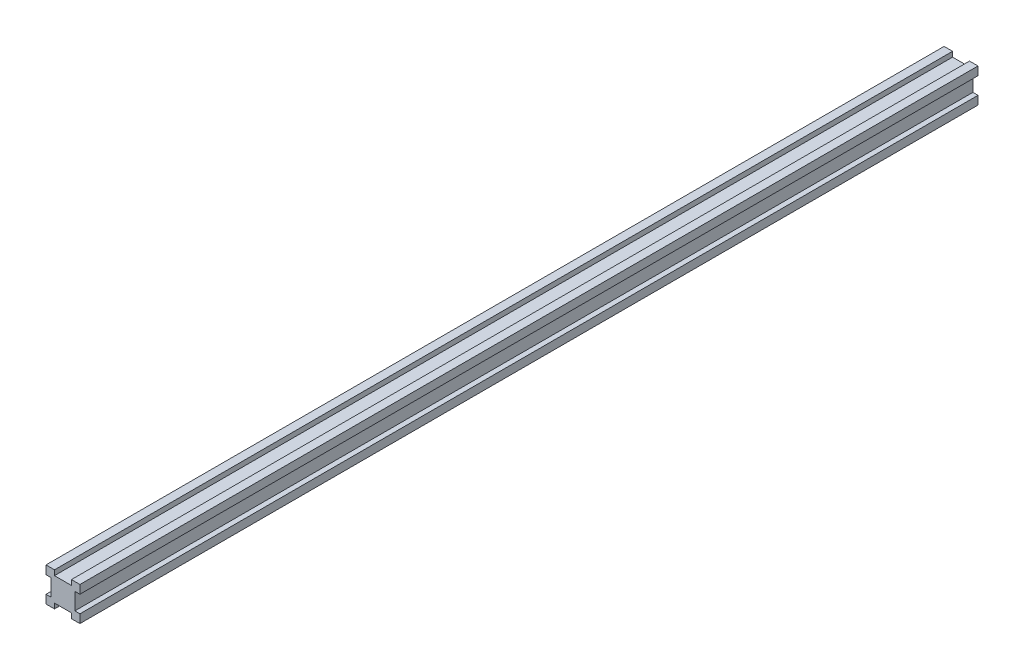
ISO-10303-21;
HEADER;
FILE_DESCRIPTION(('STEP AP214'),'2;1');
FILE_NAME('part.step','',(''),(''),'','','');
FILE_SCHEMA(('AUTOMOTIVE_DESIGN { 1 0 10303 214 1 1 1 1 }'));
ENDSEC;
DATA;
#1=APPLICATION_CONTEXT('core data for automotive mechanical design processes');
#2=APPLICATION_PROTOCOL_DEFINITION('international standard','automotive_design',2000,#1);
#3=PRODUCT_CONTEXT('',#1,'mechanical');
#4=PRODUCT('Part','Part','',(#3));
#5=PRODUCT_RELATED_PRODUCT_CATEGORY('part','',(#4));
#6=PRODUCT_DEFINITION_FORMATION('','',#4);
#7=PRODUCT_DEFINITION_CONTEXT('part definition',#1,'design');
#8=PRODUCT_DEFINITION('design','',#6,#7);
#9=PRODUCT_DEFINITION_SHAPE('','',#8);
#10=(LENGTH_UNIT() NAMED_UNIT(*) SI_UNIT(.MILLI.,.METRE.));
#11=(NAMED_UNIT(*) PLANE_ANGLE_UNIT() SI_UNIT($,.RADIAN.));
#12=(NAMED_UNIT(*) SI_UNIT($,.STERADIAN.) SOLID_ANGLE_UNIT());
#13=UNCERTAINTY_MEASURE_WITH_UNIT(LENGTH_MEASURE(1.E-05),#10,'distance_accuracy_value','');
#14=(GEOMETRIC_REPRESENTATION_CONTEXT(3) GLOBAL_UNCERTAINTY_ASSIGNED_CONTEXT((#13)) GLOBAL_UNIT_ASSIGNED_CONTEXT((#10,
#11,#12)) REPRESENTATION_CONTEXT('',''));
#15=CARTESIAN_POINT('',(0.,0.,0.));
#16=DIRECTION('',(0.,0.,1.));
#17=DIRECTION('',(1.,0.,0.));
#18=AXIS2_PLACEMENT_3D('',#15,#16,#17);
#19=CARTESIAN_POINT('',(-10.,0.,265.));
#20=DIRECTION('',(-1.,0.,0.));
#21=DIRECTION('',(0.,-1.,0.));
#22=AXIS2_PLACEMENT_3D('',#19,#20,#21);
#23=PLANE('',#22);
#24=DIRECTION('',(0.,1.,0.));
#25=VECTOR('',#24,1.);
#26=CARTESIAN_POINT('',(-10.,0.,-265.));
#27=LINE('',#26,#25);
#28=CARTESIAN_POINT('',(-10.,5.,-265.));
#29=VERTEX_POINT('',#28);
#30=CARTESIAN_POINT('',(-10.,10.,-265.));
#31=VERTEX_POINT('',#30);
#32=EDGE_CURVE('E204',#29,#31,#27,.T.);
#33=ORIENTED_EDGE('',*,*,#32,.F.);
#34=DIRECTION('',(0.,0.,-1.));
#35=VECTOR('',#34,1.);
#36=CARTESIAN_POINT('',(-10.,5.,265.));
#37=LINE('',#36,#35);
#38=CARTESIAN_POINT('',(-10.,5.,265.));
#39=VERTEX_POINT('',#38);
#40=EDGE_CURVE('E11',#39,#29,#37,.T.);
#41=ORIENTED_EDGE('',*,*,#40,.F.);
#42=DIRECTION('',(0.,1.,0.));
#43=VECTOR('',#42,1.);
#44=CARTESIAN_POINT('',(-10.,0.,265.));
#45=LINE('',#44,#43);
#46=CARTESIAN_POINT('',(-10.,10.,265.));
#47=VERTEX_POINT('',#46);
#48=EDGE_CURVE('E258',#39,#47,#45,.T.);
#49=ORIENTED_EDGE('',*,*,#48,.T.);
#50=DIRECTION('',(0.,0.,-1.));
#51=VECTOR('',#50,1.);
#52=CARTESIAN_POINT('',(-10.,10.,265.));
#53=LINE('',#52,#51);
#54=EDGE_CURVE('E55',#47,#31,#53,.T.);
#55=ORIENTED_EDGE('',*,*,#54,.T.);
#56=EDGE_LOOP('',(#33,#41,#49,#55));
#57=FACE_BOUND('',#56,.T.);
#58=ADVANCED_FACE('F39',(#57),#23,.T.);
#59=CARTESIAN_POINT('',(0.,5.,265.));
#60=DIRECTION('',(0.,-1.,0.));
#61=DIRECTION('',(1.,0.,0.));
#62=AXIS2_PLACEMENT_3D('',#59,#60,#61);
#63=PLANE('',#62);
#64=DIRECTION('',(-1.,0.,0.));
#65=VECTOR('',#64,1.);
#66=CARTESIAN_POINT('',(0.,5.,-265.));
#67=LINE('',#66,#65);
#68=CARTESIAN_POINT('',(-7.,5.,-265.));
#69=VERTEX_POINT('',#68);
#70=EDGE_CURVE('E206',#69,#29,#67,.T.);
#71=ORIENTED_EDGE('',*,*,#70,.F.);
#72=DIRECTION('',(0.,0.,-1.));
#73=VECTOR('',#72,1.);
#74=CARTESIAN_POINT('',(-7.,5.,265.));
#75=LINE('',#74,#73);
#76=CARTESIAN_POINT('',(-7.,5.,265.));
#77=VERTEX_POINT('',#76);
#78=EDGE_CURVE('E47',#77,#69,#75,.T.);
#79=ORIENTED_EDGE('',*,*,#78,.F.);
#80=DIRECTION('',(-1.,0.,0.));
#81=VECTOR('',#80,1.);
#82=CARTESIAN_POINT('',(0.,5.,265.));
#83=LINE('',#82,#81);
#84=EDGE_CURVE('E313',#77,#39,#83,.T.);
#85=ORIENTED_EDGE('',*,*,#84,.T.);
#86=ORIENTED_EDGE('',*,*,#40,.T.);
#87=EDGE_LOOP('',(#71,#79,#85,#86));
#88=FACE_BOUND('',#87,.T.);
#89=ADVANCED_FACE('F300',(#88),#63,.T.);
#90=CARTESIAN_POINT('',(-7.,0.,265.));
#91=DIRECTION('',(-1.,0.,0.));
#92=DIRECTION('',(0.,-1.,0.));
#93=AXIS2_PLACEMENT_3D('',#90,#91,#92);
#94=PLANE('',#93);
#95=DIRECTION('',(0.,1.,0.));
#96=VECTOR('',#95,1.);
#97=CARTESIAN_POINT('',(-7.,0.,-265.));
#98=LINE('',#97,#96);
#99=CARTESIAN_POINT('',(-7.,-5.,-265.));
#100=VERTEX_POINT('',#99);
#101=EDGE_CURVE('E209',#100,#69,#98,.T.);
#102=ORIENTED_EDGE('',*,*,#101,.F.);
#103=DIRECTION('',(0.,0.,-1.));
#104=VECTOR('',#103,1.);
#105=CARTESIAN_POINT('',(-7.,-5.,265.));
#106=LINE('',#105,#104);
#107=CARTESIAN_POINT('',(-7.,-5.,265.));
#108=VERTEX_POINT('',#107);
#109=EDGE_CURVE('E289',#108,#100,#106,.T.);
#110=ORIENTED_EDGE('',*,*,#109,.F.);
#111=DIRECTION('',(0.,1.,0.));
#112=VECTOR('',#111,1.);
#113=CARTESIAN_POINT('',(-7.,0.,265.));
#114=LINE('',#113,#112);
#115=EDGE_CURVE('E296',#108,#77,#114,.T.);
#116=ORIENTED_EDGE('',*,*,#115,.T.);
#117=ORIENTED_EDGE('',*,*,#78,.T.);
#118=EDGE_LOOP('',(#102,#110,#116,#117));
#119=FACE_BOUND('',#118,.T.);
#120=ADVANCED_FACE('F294',(#119),#94,.T.);
#121=CARTESIAN_POINT('',(0.,-5.,265.));
#122=DIRECTION('',(0.,1.,0.));
#123=DIRECTION('',(-1.,0.,0.));
#124=AXIS2_PLACEMENT_3D('',#121,#122,#123);
#125=PLANE('',#124);
#126=DIRECTION('',(1.,0.,0.));
#127=VECTOR('',#126,1.);
#128=CARTESIAN_POINT('',(0.,-5.,-265.));
#129=LINE('',#128,#127);
#130=CARTESIAN_POINT('',(-10.,-5.,-265.));
#131=VERTEX_POINT('',#130);
#132=EDGE_CURVE('E212',#131,#100,#129,.T.);
#133=ORIENTED_EDGE('',*,*,#132,.F.);
#134=DIRECTION('',(0.,0.,-1.));
#135=VECTOR('',#134,1.);
#136=CARTESIAN_POINT('',(-10.,-5.,265.));
#137=LINE('',#136,#135);
#138=CARTESIAN_POINT('',(-10.,-5.,265.));
#139=VERTEX_POINT('',#138);
#140=EDGE_CURVE('E287',#139,#131,#137,.T.);
#141=ORIENTED_EDGE('',*,*,#140,.F.);
#142=DIRECTION('',(1.,0.,0.));
#143=VECTOR('',#142,1.);
#144=CARTESIAN_POINT('',(0.,-5.,265.));
#145=LINE('',#144,#143);
#146=EDGE_CURVE('E310',#139,#108,#145,.T.);
#147=ORIENTED_EDGE('',*,*,#146,.T.);
#148=ORIENTED_EDGE('',*,*,#109,.T.);
#149=EDGE_LOOP('',(#133,#141,#147,#148));
#150=FACE_BOUND('',#149,.T.);
#151=ADVANCED_FACE('F307',(#150),#125,.T.);
#152=CARTESIAN_POINT('',(-9.99999999999999,0.,265.));
#153=DIRECTION('',(-1.,0.,0.));
#154=DIRECTION('',(0.,-1.,0.));
#155=AXIS2_PLACEMENT_3D('',#152,#153,#154);
#156=PLANE('',#155);
#157=DIRECTION('',(0.,1.,0.));
#158=VECTOR('',#157,1.);
#159=CARTESIAN_POINT('',(-9.99999999999999,0.,-265.));
#160=LINE('',#159,#158);
#161=CARTESIAN_POINT('',(-10.,-10.,-265.));
#162=VERTEX_POINT('',#161);
#163=EDGE_CURVE('E215',#162,#131,#160,.T.);
#164=ORIENTED_EDGE('',*,*,#163,.F.);
#165=DIRECTION('',(0.,0.,-1.));
#166=VECTOR('',#165,1.);
#167=CARTESIAN_POINT('',(-10.,-10.,265.));
#168=LINE('',#167,#166);
#169=CARTESIAN_POINT('',(-10.,-10.,265.));
#170=VERTEX_POINT('',#169);
#171=EDGE_CURVE('E285',#170,#162,#168,.T.);
#172=ORIENTED_EDGE('',*,*,#171,.F.);
#173=DIRECTION('',(0.,1.,0.));
#174=VECTOR('',#173,1.);
#175=CARTESIAN_POINT('',(-9.99999999999999,0.,265.));
#176=LINE('',#175,#174);
#177=EDGE_CURVE('E315',#170,#139,#176,.T.);
#178=ORIENTED_EDGE('',*,*,#177,.T.);
#179=ORIENTED_EDGE('',*,*,#140,.T.);
#180=EDGE_LOOP('',(#164,#172,#178,#179));
#181=FACE_BOUND('',#180,.T.);
#182=ADVANCED_FACE('F373',(#181),#156,.T.);
#183=CARTESIAN_POINT('',(0.,-10.,265.));
#184=DIRECTION('',(0.,1.,0.));
#185=DIRECTION('',(0.,0.,1.));
#186=AXIS2_PLACEMENT_3D('',#183,#184,#185);
#187=PLANE('',#186);
#188=DIRECTION('',(1.,0.,0.));
#189=VECTOR('',#188,1.);
#190=CARTESIAN_POINT('',(0.,-10.,-265.));
#191=LINE('',#190,#189);
#192=CARTESIAN_POINT('',(-5.,-10.,-265.));
#193=VERTEX_POINT('',#192);
#194=EDGE_CURVE('E218',#162,#193,#191,.T.);
#195=ORIENTED_EDGE('',*,*,#194,.T.);
#196=DIRECTION('',(0.,0.,-1.));
#197=VECTOR('',#196,1.);
#198=CARTESIAN_POINT('',(-5.,-10.,265.));
#199=LINE('',#198,#197);
#200=CARTESIAN_POINT('',(-5.,-10.,265.));
#201=VERTEX_POINT('',#200);
#202=EDGE_CURVE('E283',#201,#193,#199,.T.);
#203=ORIENTED_EDGE('',*,*,#202,.F.);
#204=DIRECTION('',(1.,0.,0.));
#205=VECTOR('',#204,1.);
#206=CARTESIAN_POINT('',(0.,-10.,265.));
#207=LINE('',#206,#205);
#208=EDGE_CURVE('E321',#170,#201,#207,.T.);
#209=ORIENTED_EDGE('',*,*,#208,.F.);
#210=ORIENTED_EDGE('',*,*,#171,.T.);
#211=EDGE_LOOP('',(#195,#203,#209,#210));
#212=FACE_BOUND('',#211,.T.);
#213=ADVANCED_FACE('F376',(#212),#187,.F.);
#214=CARTESIAN_POINT('',(-5.,0.,265.));
#215=DIRECTION('',(1.,0.,0.));
#216=DIRECTION('',(0.,0.,-1.));
#217=AXIS2_PLACEMENT_3D('',#214,#215,#216);
#218=PLANE('',#217);
#219=DIRECTION('',(0.,-1.,0.));
#220=VECTOR('',#219,1.);
#221=CARTESIAN_POINT('',(-5.,0.,-265.));
#222=LINE('',#221,#220);
#223=CARTESIAN_POINT('',(-5.,-7.,-265.));
#224=VERTEX_POINT('',#223);
#225=EDGE_CURVE('E221',#224,#193,#222,.T.);
#226=ORIENTED_EDGE('',*,*,#225,.F.);
#227=DIRECTION('',(0.,0.,-1.));
#228=VECTOR('',#227,1.);
#229=CARTESIAN_POINT('',(-5.,-7.,265.));
#230=LINE('',#229,#228);
#231=CARTESIAN_POINT('',(-5.,-7.,265.));
#232=VERTEX_POINT('',#231);
#233=EDGE_CURVE('E281',#232,#224,#230,.T.);
#234=ORIENTED_EDGE('',*,*,#233,.F.);
#235=DIRECTION('',(0.,-1.,0.));
#236=VECTOR('',#235,1.);
#237=CARTESIAN_POINT('',(-5.,0.,265.));
#238=LINE('',#237,#236);
#239=EDGE_CURVE('E323',#232,#201,#238,.T.);
#240=ORIENTED_EDGE('',*,*,#239,.T.);
#241=ORIENTED_EDGE('',*,*,#202,.T.);
#242=EDGE_LOOP('',(#226,#234,#240,#241));
#243=FACE_BOUND('',#242,.T.);
#244=ADVANCED_FACE('F378',(#243),#218,.T.);
#245=CARTESIAN_POINT('',(0.,-7.,265.));
#246=DIRECTION('',(0.,-1.,0.));
#247=DIRECTION('',(1.,0.,0.));
#248=AXIS2_PLACEMENT_3D('',#245,#246,#247);
#249=PLANE('',#248);
#250=DIRECTION('',(-1.,0.,0.));
#251=VECTOR('',#250,1.);
#252=CARTESIAN_POINT('',(0.,-7.,-265.));
#253=LINE('',#252,#251);
#254=CARTESIAN_POINT('',(5.,-7.,-265.));
#255=VERTEX_POINT('',#254);
#256=EDGE_CURVE('E225',#255,#224,#253,.T.);
#257=ORIENTED_EDGE('',*,*,#256,.F.);
#258=DIRECTION('',(0.,0.,-1.));
#259=VECTOR('',#258,1.);
#260=CARTESIAN_POINT('',(5.,-7.,265.));
#261=LINE('',#260,#259);
#262=CARTESIAN_POINT('',(5.,-7.,265.));
#263=VERTEX_POINT('',#262);
#264=EDGE_CURVE('E279',#263,#255,#261,.T.);
#265=ORIENTED_EDGE('',*,*,#264,.F.);
#266=DIRECTION('',(-1.,0.,0.));
#267=VECTOR('',#266,1.);
#268=CARTESIAN_POINT('',(0.,-7.,265.));
#269=LINE('',#268,#267);
#270=EDGE_CURVE('E327',#263,#232,#269,.T.);
#271=ORIENTED_EDGE('',*,*,#270,.T.);
#272=ORIENTED_EDGE('',*,*,#233,.T.);
#273=EDGE_LOOP('',(#257,#265,#271,#272));
#274=FACE_BOUND('',#273,.T.);
#275=ADVANCED_FACE('F381',(#274),#249,.T.);
#276=CARTESIAN_POINT('',(5.,0.,265.));
#277=DIRECTION('',(-1.,0.,0.));
#278=DIRECTION('',(0.,0.,1.));
#279=AXIS2_PLACEMENT_3D('',#276,#277,#278);
#280=PLANE('',#279);
#281=DIRECTION('',(0.,1.,0.));
#282=VECTOR('',#281,1.);
#283=CARTESIAN_POINT('',(5.,0.,-265.));
#284=LINE('',#283,#282);
#285=CARTESIAN_POINT('',(5.,-10.,-265.));
#286=VERTEX_POINT('',#285);
#287=EDGE_CURVE('E228',#286,#255,#284,.T.);
#288=ORIENTED_EDGE('',*,*,#287,.F.);
#289=DIRECTION('',(0.,0.,-1.));
#290=VECTOR('',#289,1.);
#291=CARTESIAN_POINT('',(5.,-10.,265.));
#292=LINE('',#291,#290);
#293=CARTESIAN_POINT('',(5.,-10.,265.));
#294=VERTEX_POINT('',#293);
#295=EDGE_CURVE('E277',#294,#286,#292,.T.);
#296=ORIENTED_EDGE('',*,*,#295,.F.);
#297=DIRECTION('',(0.,1.,0.));
#298=VECTOR('',#297,1.);
#299=CARTESIAN_POINT('',(5.,0.,265.));
#300=LINE('',#299,#298);
#301=EDGE_CURVE('E330',#294,#263,#300,.T.);
#302=ORIENTED_EDGE('',*,*,#301,.T.);
#303=ORIENTED_EDGE('',*,*,#264,.T.);
#304=EDGE_LOOP('',(#288,#296,#302,#303));
#305=FACE_BOUND('',#304,.T.);
#306=ADVANCED_FACE('F385',(#305),#280,.T.);
#307=CARTESIAN_POINT('',(10.,-10.,-265.));
#308=VERTEX_POINT('',#307);
#309=EDGE_CURVE('E222',#286,#308,#191,.T.);
#310=ORIENTED_EDGE('',*,*,#309,.T.);
#311=DIRECTION('',(0.,0.,-1.));
#312=VECTOR('',#311,1.);
#313=CARTESIAN_POINT('',(10.,-10.,265.));
#314=LINE('',#313,#312);
#315=CARTESIAN_POINT('',(10.,-10.,265.));
#316=VERTEX_POINT('',#315);
#317=EDGE_CURVE('E274',#316,#308,#314,.T.);
#318=ORIENTED_EDGE('',*,*,#317,.F.);
#319=EDGE_CURVE('E324',#294,#316,#207,.T.);
#320=ORIENTED_EDGE('',*,*,#319,.F.);
#321=ORIENTED_EDGE('',*,*,#295,.T.);
#322=EDGE_LOOP('',(#310,#318,#320,#321));
#323=FACE_BOUND('',#322,.T.);
#324=ADVANCED_FACE('F389',(#323),#187,.F.);
#325=CARTESIAN_POINT('',(10.,0.,265.));
#326=DIRECTION('',(-1.,0.,0.));
#327=DIRECTION('',(0.,0.,1.));
#328=AXIS2_PLACEMENT_3D('',#325,#326,#327);
#329=PLANE('',#328);
#330=DIRECTION('',(0.,1.,0.));
#331=VECTOR('',#330,1.);
#332=CARTESIAN_POINT('',(10.,0.,-265.));
#333=LINE('',#332,#331);
#334=CARTESIAN_POINT('',(10.,-5.,-265.));
#335=VERTEX_POINT('',#334);
#336=EDGE_CURVE('E231',#308,#335,#333,.T.);
#337=ORIENTED_EDGE('',*,*,#336,.T.);
#338=DIRECTION('',(0.,0.,-1.));
#339=VECTOR('',#338,1.);
#340=CARTESIAN_POINT('',(10.,-5.,265.));
#341=LINE('',#340,#339);
#342=CARTESIAN_POINT('',(10.,-5.,265.));
#343=VERTEX_POINT('',#342);
#344=EDGE_CURVE('E272',#343,#335,#341,.T.);
#345=ORIENTED_EDGE('',*,*,#344,.F.);
#346=DIRECTION('',(0.,1.,0.));
#347=VECTOR('',#346,1.);
#348=CARTESIAN_POINT('',(10.,0.,265.));
#349=LINE('',#348,#347);
#350=EDGE_CURVE('E333',#316,#343,#349,.T.);
#351=ORIENTED_EDGE('',*,*,#350,.F.);
#352=ORIENTED_EDGE('',*,*,#317,.T.);
#353=EDGE_LOOP('',(#337,#345,#351,#352));
#354=FACE_BOUND('',#353,.T.);
#355=ADVANCED_FACE('F393',(#354),#329,.F.);
#356=CARTESIAN_POINT('',(0.,-5.,265.));
#357=DIRECTION('',(0.,1.,0.));
#358=DIRECTION('',(-1.,0.,0.));
#359=AXIS2_PLACEMENT_3D('',#356,#357,#358);
#360=PLANE('',#359);
#361=DIRECTION('',(1.,0.,0.));
#362=VECTOR('',#361,1.);
#363=CARTESIAN_POINT('',(0.,-5.,-265.));
#364=LINE('',#363,#362);
#365=CARTESIAN_POINT('',(7.,-5.,-265.));
#366=VERTEX_POINT('',#365);
#367=EDGE_CURVE('E234',#366,#335,#364,.T.);
#368=ORIENTED_EDGE('',*,*,#367,.F.);
#369=DIRECTION('',(0.,0.,-1.));
#370=VECTOR('',#369,1.);
#371=CARTESIAN_POINT('',(7.,-5.,265.));
#372=LINE('',#371,#370);
#373=CARTESIAN_POINT('',(7.,-5.,265.));
#374=VERTEX_POINT('',#373);
#375=EDGE_CURVE('E270',#374,#366,#372,.T.);
#376=ORIENTED_EDGE('',*,*,#375,.F.);
#377=DIRECTION('',(1.,0.,0.));
#378=VECTOR('',#377,1.);
#379=CARTESIAN_POINT('',(0.,-5.,265.));
#380=LINE('',#379,#378);
#381=EDGE_CURVE('E335',#374,#343,#380,.T.);
#382=ORIENTED_EDGE('',*,*,#381,.T.);
#383=ORIENTED_EDGE('',*,*,#344,.T.);
#384=EDGE_LOOP('',(#368,#376,#382,#383));
#385=FACE_BOUND('',#384,.T.);
#386=ADVANCED_FACE('F397',(#385),#360,.T.);
#387=CARTESIAN_POINT('',(7.,0.,265.));
#388=DIRECTION('',(1.,0.,0.));
#389=DIRECTION('',(0.,0.,-1.));
#390=AXIS2_PLACEMENT_3D('',#387,#388,#389);
#391=PLANE('',#390);
#392=DIRECTION('',(0.,-1.,0.));
#393=VECTOR('',#392,1.);
#394=CARTESIAN_POINT('',(7.,0.,-265.));
#395=LINE('',#394,#393);
#396=CARTESIAN_POINT('',(7.,5.,-265.));
#397=VERTEX_POINT('',#396);
#398=EDGE_CURVE('E237',#397,#366,#395,.T.);
#399=ORIENTED_EDGE('',*,*,#398,.F.);
#400=DIRECTION('',(0.,0.,-1.));
#401=VECTOR('',#400,1.);
#402=CARTESIAN_POINT('',(7.,5.,265.));
#403=LINE('',#402,#401);
#404=CARTESIAN_POINT('',(7.,5.,265.));
#405=VERTEX_POINT('',#404);
#406=EDGE_CURVE('E268',#405,#397,#403,.T.);
#407=ORIENTED_EDGE('',*,*,#406,.F.);
#408=DIRECTION('',(0.,-1.,0.));
#409=VECTOR('',#408,1.);
#410=CARTESIAN_POINT('',(7.,0.,265.));
#411=LINE('',#410,#409);
#412=EDGE_CURVE('E338',#405,#374,#411,.T.);
#413=ORIENTED_EDGE('',*,*,#412,.T.);
#414=ORIENTED_EDGE('',*,*,#375,.T.);
#415=EDGE_LOOP('',(#399,#407,#413,#414));
#416=FACE_BOUND('',#415,.T.);
#417=ADVANCED_FACE('F401',(#416),#391,.T.);
#418=CARTESIAN_POINT('',(0.,5.,265.));
#419=DIRECTION('',(0.,-1.,0.));
#420=DIRECTION('',(1.,0.,0.));
#421=AXIS2_PLACEMENT_3D('',#418,#419,#420);
#422=PLANE('',#421);
#423=DIRECTION('',(-1.,0.,0.));
#424=VECTOR('',#423,1.);
#425=CARTESIAN_POINT('',(0.,5.,-265.));
#426=LINE('',#425,#424);
#427=CARTESIAN_POINT('',(10.,5.,-265.));
#428=VERTEX_POINT('',#427);
#429=EDGE_CURVE('E240',#428,#397,#426,.T.);
#430=ORIENTED_EDGE('',*,*,#429,.F.);
#431=DIRECTION('',(0.,0.,-1.));
#432=VECTOR('',#431,1.);
#433=CARTESIAN_POINT('',(10.,5.,265.));
#434=LINE('',#433,#432);
#435=CARTESIAN_POINT('',(10.,5.,265.));
#436=VERTEX_POINT('',#435);
#437=EDGE_CURVE('E266',#436,#428,#434,.T.);
#438=ORIENTED_EDGE('',*,*,#437,.F.);
#439=DIRECTION('',(-1.,0.,0.));
#440=VECTOR('',#439,1.);
#441=CARTESIAN_POINT('',(0.,5.,265.));
#442=LINE('',#441,#440);
#443=EDGE_CURVE('E341',#436,#405,#442,.T.);
#444=ORIENTED_EDGE('',*,*,#443,.T.);
#445=ORIENTED_EDGE('',*,*,#406,.T.);
#446=EDGE_LOOP('',(#430,#438,#444,#445));
#447=FACE_BOUND('',#446,.T.);
#448=ADVANCED_FACE('F405',(#447),#422,.T.);
#449=CARTESIAN_POINT('',(10.,0.,265.));
#450=DIRECTION('',(-1.,0.,0.));
#451=DIRECTION('',(0.,0.,1.));
#452=AXIS2_PLACEMENT_3D('',#449,#450,#451);
#453=PLANE('',#452);
#454=DIRECTION('',(0.,1.,0.));
#455=VECTOR('',#454,1.);
#456=CARTESIAN_POINT('',(10.,0.,-265.));
#457=LINE('',#456,#455);
#458=CARTESIAN_POINT('',(10.,10.,-265.));
#459=VERTEX_POINT('',#458);
#460=EDGE_CURVE('E243',#428,#459,#457,.T.);
#461=ORIENTED_EDGE('',*,*,#460,.T.);
#462=DIRECTION('',(0.,0.,-1.));
#463=VECTOR('',#462,1.);
#464=CARTESIAN_POINT('',(10.,10.,265.));
#465=LINE('',#464,#463);
#466=CARTESIAN_POINT('',(10.,10.,265.));
#467=VERTEX_POINT('',#466);
#468=EDGE_CURVE('E264',#467,#459,#465,.T.);
#469=ORIENTED_EDGE('',*,*,#468,.F.);
#470=DIRECTION('',(0.,1.,0.));
#471=VECTOR('',#470,1.);
#472=CARTESIAN_POINT('',(10.,0.,265.));
#473=LINE('',#472,#471);
#474=EDGE_CURVE('E344',#436,#467,#473,.T.);
#475=ORIENTED_EDGE('',*,*,#474,.F.);
#476=ORIENTED_EDGE('',*,*,#437,.T.);
#477=EDGE_LOOP('',(#461,#469,#475,#476));
#478=FACE_BOUND('',#477,.T.);
#479=ADVANCED_FACE('F409',(#478),#453,.F.);
#480=CARTESIAN_POINT('',(0.,10.,265.));
#481=DIRECTION('',(0.,1.,0.));
#482=DIRECTION('',(0.,0.,1.));
#483=AXIS2_PLACEMENT_3D('',#480,#481,#482);
#484=PLANE('',#483);
#485=DIRECTION('',(1.,0.,0.));
#486=VECTOR('',#485,1.);
#487=CARTESIAN_POINT('',(0.,10.,-265.));
#488=LINE('',#487,#486);
#489=CARTESIAN_POINT('',(5.,10.,-265.));
#490=VERTEX_POINT('',#489);
#491=EDGE_CURVE('E246',#490,#459,#488,.T.);
#492=ORIENTED_EDGE('',*,*,#491,.F.);
#493=DIRECTION('',(0.,0.,-1.));
#494=VECTOR('',#493,1.);
#495=CARTESIAN_POINT('',(5.,10.,265.));
#496=LINE('',#495,#494);
#497=CARTESIAN_POINT('',(5.,10.,265.));
#498=VERTEX_POINT('',#497);
#499=EDGE_CURVE('E262',#498,#490,#496,.T.);
#500=ORIENTED_EDGE('',*,*,#499,.F.);
#501=DIRECTION('',(1.,0.,0.));
#502=VECTOR('',#501,1.);
#503=CARTESIAN_POINT('',(0.,10.,265.));
#504=LINE('',#503,#502);
#505=EDGE_CURVE('E346',#498,#467,#504,.T.);
#506=ORIENTED_EDGE('',*,*,#505,.T.);
#507=ORIENTED_EDGE('',*,*,#468,.T.);
#508=EDGE_LOOP('',(#492,#500,#506,#507));
#509=FACE_BOUND('',#508,.T.);
#510=ADVANCED_FACE('F413',(#509),#484,.T.);
#511=CARTESIAN_POINT('',(5.,0.,265.));
#512=DIRECTION('',(-1.,0.,0.));
#513=DIRECTION('',(0.,-1.,0.));
#514=AXIS2_PLACEMENT_3D('',#511,#512,#513);
#515=PLANE('',#514);
#516=DIRECTION('',(0.,1.,0.));
#517=VECTOR('',#516,1.);
#518=CARTESIAN_POINT('',(5.,0.,-265.));
#519=LINE('',#518,#517);
#520=CARTESIAN_POINT('',(5.,7.,-265.));
#521=VERTEX_POINT('',#520);
#522=EDGE_CURVE('E249',#521,#490,#519,.T.);
#523=ORIENTED_EDGE('',*,*,#522,.F.);
#524=DIRECTION('',(0.,0.,-1.));
#525=VECTOR('',#524,1.);
#526=CARTESIAN_POINT('',(5.,7.,265.));
#527=LINE('',#526,#525);
#528=CARTESIAN_POINT('',(5.,7.,265.));
#529=VERTEX_POINT('',#528);
#530=EDGE_CURVE('E186',#529,#521,#527,.T.);
#531=ORIENTED_EDGE('',*,*,#530,.F.);
#532=DIRECTION('',(0.,1.,0.));
#533=VECTOR('',#532,1.);
#534=CARTESIAN_POINT('',(5.,0.,265.));
#535=LINE('',#534,#533);
#536=EDGE_CURVE('E196',#529,#498,#535,.T.);
#537=ORIENTED_EDGE('',*,*,#536,.T.);
#538=ORIENTED_EDGE('',*,*,#499,.T.);
#539=EDGE_LOOP('',(#523,#531,#537,#538));
#540=FACE_BOUND('',#539,.T.);
#541=ADVANCED_FACE('F350',(#540),#515,.T.);
#542=CARTESIAN_POINT('',(0.,7.,265.));
#543=DIRECTION('',(0.,1.,0.));
#544=DIRECTION('',(0.,0.,1.));
#545=AXIS2_PLACEMENT_3D('',#542,#543,#544);
#546=PLANE('',#545);
#547=DIRECTION('',(1.,0.,0.));
#548=VECTOR('',#547,1.);
#549=CARTESIAN_POINT('',(0.,7.,-265.));
#550=LINE('',#549,#548);
#551=CARTESIAN_POINT('',(-5.,7.,-265.));
#552=VERTEX_POINT('',#551);
#553=EDGE_CURVE('E182',#552,#521,#550,.T.);
#554=ORIENTED_EDGE('',*,*,#553,.F.);
#555=DIRECTION('',(0.,0.,-1.));
#556=VECTOR('',#555,1.);
#557=CARTESIAN_POINT('',(-5.,7.,265.));
#558=LINE('',#557,#556);
#559=CARTESIAN_POINT('',(-5.,7.,265.));
#560=VERTEX_POINT('',#559);
#561=EDGE_CURVE('E177',#560,#552,#558,.T.);
#562=ORIENTED_EDGE('',*,*,#561,.F.);
#563=DIRECTION('',(1.,0.,0.));
#564=VECTOR('',#563,1.);
#565=CARTESIAN_POINT('',(0.,7.,265.));
#566=LINE('',#565,#564);
#567=EDGE_CURVE('E180',#560,#529,#566,.T.);
#568=ORIENTED_EDGE('',*,*,#567,.T.);
#569=ORIENTED_EDGE('',*,*,#530,.T.);
#570=EDGE_LOOP('',(#554,#562,#568,#569));
#571=FACE_BOUND('',#570,.T.);
#572=ADVANCED_FACE('F179',(#571),#546,.T.);
#573=CARTESIAN_POINT('',(-5.,0.,265.));
#574=DIRECTION('',(1.,0.,0.));
#575=DIRECTION('',(0.,1.,0.));
#576=AXIS2_PLACEMENT_3D('',#573,#574,#575);
#577=PLANE('',#576);
#578=DIRECTION('',(0.,-1.,0.));
#579=VECTOR('',#578,1.);
#580=CARTESIAN_POINT('',(-5.,0.,-265.));
#581=LINE('',#580,#579);
#582=CARTESIAN_POINT('',(-5.,10.,-265.));
#583=VERTEX_POINT('',#582);
#584=EDGE_CURVE('E253',#583,#552,#581,.T.);
#585=ORIENTED_EDGE('',*,*,#584,.F.);
#586=DIRECTION('',(0.,0.,-1.));
#587=VECTOR('',#586,1.);
#588=CARTESIAN_POINT('',(-5.,10.,265.));
#589=LINE('',#588,#587);
#590=CARTESIAN_POINT('',(-5.,10.,265.));
#591=VERTEX_POINT('',#590);
#592=EDGE_CURVE('E116',#591,#583,#589,.T.);
#593=ORIENTED_EDGE('',*,*,#592,.F.);
#594=DIRECTION('',(0.,-1.,0.));
#595=VECTOR('',#594,1.);
#596=CARTESIAN_POINT('',(-5.,0.,265.));
#597=LINE('',#596,#595);
#598=EDGE_CURVE('E193',#591,#560,#597,.T.);
#599=ORIENTED_EDGE('',*,*,#598,.T.);
#600=ORIENTED_EDGE('',*,*,#561,.T.);
#601=EDGE_LOOP('',(#585,#593,#599,#600));
#602=FACE_BOUND('',#601,.T.);
#603=ADVANCED_FACE('F198',(#602),#577,.T.);
#604=CARTESIAN_POINT('',(0.,10.,265.));
#605=DIRECTION('',(0.,1.,0.));
#606=DIRECTION('',(0.,0.,1.));
#607=AXIS2_PLACEMENT_3D('',#604,#605,#606);
#608=PLANE('',#607);
#609=DIRECTION('',(1.,0.,0.));
#610=VECTOR('',#609,1.);
#611=CARTESIAN_POINT('',(0.,10.,-265.));
#612=LINE('',#611,#610);
#613=EDGE_CURVE('E255',#31,#583,#612,.T.);
#614=ORIENTED_EDGE('',*,*,#613,.F.);
#615=ORIENTED_EDGE('',*,*,#54,.F.);
#616=DIRECTION('',(1.,0.,0.));
#617=VECTOR('',#616,1.);
#618=CARTESIAN_POINT('',(0.,10.,265.));
#619=LINE('',#618,#617);
#620=EDGE_CURVE('E199',#47,#591,#619,.T.);
#621=ORIENTED_EDGE('',*,*,#620,.T.);
#622=ORIENTED_EDGE('',*,*,#592,.T.);
#623=EDGE_LOOP('',(#614,#615,#621,#622));
#624=FACE_BOUND('',#623,.T.);
#625=ADVANCED_FACE('F352',(#624),#608,.T.);
#626=CARTESIAN_POINT('',(0.,0.,265.));
#627=DIRECTION('',(0.,0.,1.));
#628=DIRECTION('',(1.,0.,0.));
#629=AXIS2_PLACEMENT_3D('',#626,#627,#628);
#630=PLANE('',#629);
#631=ORIENTED_EDGE('',*,*,#48,.F.);
#632=ORIENTED_EDGE('',*,*,#84,.F.);
#633=ORIENTED_EDGE('',*,*,#115,.F.);
#634=ORIENTED_EDGE('',*,*,#146,.F.);
#635=ORIENTED_EDGE('',*,*,#177,.F.);
#636=ORIENTED_EDGE('',*,*,#208,.T.);
#637=ORIENTED_EDGE('',*,*,#239,.F.);
#638=ORIENTED_EDGE('',*,*,#270,.F.);
#639=ORIENTED_EDGE('',*,*,#301,.F.);
#640=ORIENTED_EDGE('',*,*,#319,.T.);
#641=ORIENTED_EDGE('',*,*,#350,.T.);
#642=ORIENTED_EDGE('',*,*,#381,.F.);
#643=ORIENTED_EDGE('',*,*,#412,.F.);
#644=ORIENTED_EDGE('',*,*,#443,.F.);
#645=ORIENTED_EDGE('',*,*,#474,.T.);
#646=ORIENTED_EDGE('',*,*,#505,.F.);
#647=ORIENTED_EDGE('',*,*,#536,.F.);
#648=ORIENTED_EDGE('',*,*,#567,.F.);
#649=ORIENTED_EDGE('',*,*,#598,.F.);
#650=ORIENTED_EDGE('',*,*,#620,.F.);
#651=EDGE_LOOP('',(#631,#632,#633,#634,#635,#636,#637,#638,#639,#640,#641,#642,#643,#644,#645,
#646,#647,#648,#649,#650));
#652=FACE_BOUND('',#651,.T.);
#653=ADVANCED_FACE('F191',(#652),#630,.T.);
#654=CARTESIAN_POINT('',(0.,0.,-265.));
#655=DIRECTION('',(0.,0.,1.));
#656=DIRECTION('',(1.,0.,0.));
#657=AXIS2_PLACEMENT_3D('',#654,#655,#656);
#658=PLANE('',#657);
#659=ORIENTED_EDGE('',*,*,#32,.T.);
#660=ORIENTED_EDGE('',*,*,#613,.T.);
#661=ORIENTED_EDGE('',*,*,#584,.T.);
#662=ORIENTED_EDGE('',*,*,#553,.T.);
#663=ORIENTED_EDGE('',*,*,#522,.T.);
#664=ORIENTED_EDGE('',*,*,#491,.T.);
#665=ORIENTED_EDGE('',*,*,#460,.F.);
#666=ORIENTED_EDGE('',*,*,#429,.T.);
#667=ORIENTED_EDGE('',*,*,#398,.T.);
#668=ORIENTED_EDGE('',*,*,#367,.T.);
#669=ORIENTED_EDGE('',*,*,#336,.F.);
#670=ORIENTED_EDGE('',*,*,#309,.F.);
#671=ORIENTED_EDGE('',*,*,#287,.T.);
#672=ORIENTED_EDGE('',*,*,#256,.T.);
#673=ORIENTED_EDGE('',*,*,#225,.T.);
#674=ORIENTED_EDGE('',*,*,#194,.F.);
#675=ORIENTED_EDGE('',*,*,#163,.T.);
#676=ORIENTED_EDGE('',*,*,#132,.T.);
#677=ORIENTED_EDGE('',*,*,#101,.T.);
#678=ORIENTED_EDGE('',*,*,#70,.T.);
#679=EDGE_LOOP('',(#659,#660,#661,#662,#663,#664,#665,#666,#667,#668,#669,#670,#671,#672,#673,
#674,#675,#676,#677,#678));
#680=FACE_BOUND('',#679,.T.);
#681=ADVANCED_FACE('F302',(#680),#658,.F.);
#682=CLOSED_SHELL('',(#58,#89,#120,#151,#182,#213,#244,#275,#306,#324,#355,#386,#417,#448,#479,
#510,#541,#572,#603,#625,#653,#681));
#683=MANIFOLD_SOLID_BREP('B2',#682);
#684=ADVANCED_BREP_SHAPE_REPRESENTATION('',(#18,#683),#14);
#685=SHAPE_DEFINITION_REPRESENTATION(#9,#684);
ENDSEC;
END-ISO-10303-21;
